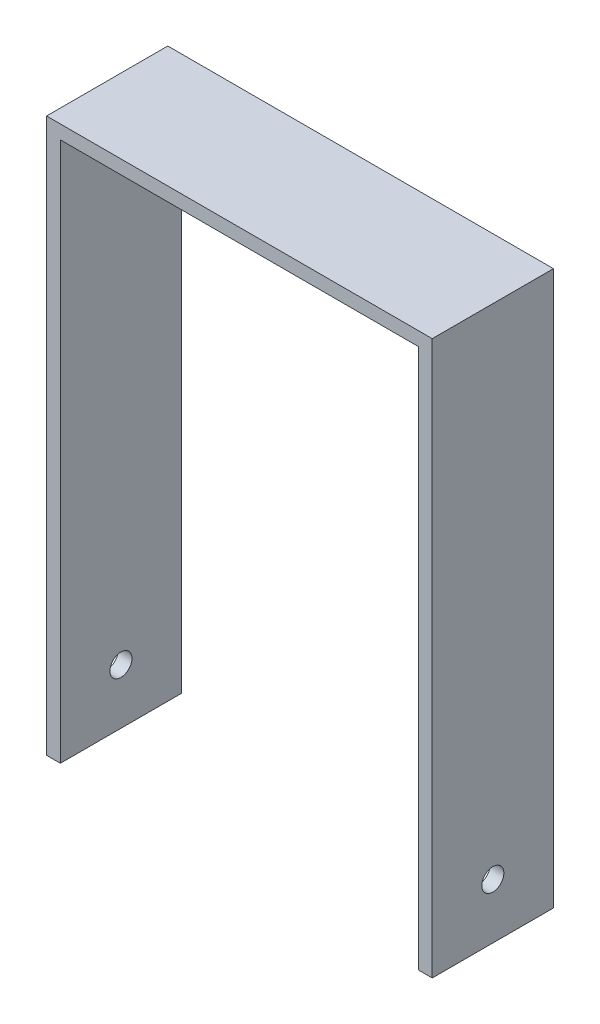
ISO-10303-21;
HEADER;
FILE_DESCRIPTION(('STEP AP214'),'2;1');
FILE_NAME('part.step','',(''),(''),'','','');
FILE_SCHEMA(('AUTOMOTIVE_DESIGN { 1 0 10303 214 1 1 1 1 }'));
ENDSEC;
DATA;
#1=APPLICATION_CONTEXT('core data for automotive mechanical design processes');
#2=APPLICATION_PROTOCOL_DEFINITION('international standard','automotive_design',2000,#1);
#3=PRODUCT_CONTEXT('',#1,'mechanical');
#4=PRODUCT('Part','Part','',(#3));
#5=PRODUCT_RELATED_PRODUCT_CATEGORY('part','',(#4));
#6=PRODUCT_DEFINITION_FORMATION('','',#4);
#7=PRODUCT_DEFINITION_CONTEXT('part definition',#1,'design');
#8=PRODUCT_DEFINITION('design','',#6,#7);
#9=PRODUCT_DEFINITION_SHAPE('','',#8);
#10=(LENGTH_UNIT() NAMED_UNIT(*) SI_UNIT(.MILLI.,.METRE.));
#11=(NAMED_UNIT(*) PLANE_ANGLE_UNIT() SI_UNIT($,.RADIAN.));
#12=(NAMED_UNIT(*) SI_UNIT($,.STERADIAN.) SOLID_ANGLE_UNIT());
#13=UNCERTAINTY_MEASURE_WITH_UNIT(LENGTH_MEASURE(1.E-05),#10,'distance_accuracy_value','');
#14=(GEOMETRIC_REPRESENTATION_CONTEXT(3) GLOBAL_UNCERTAINTY_ASSIGNED_CONTEXT((#13)) GLOBAL_UNIT_ASSIGNED_CONTEXT((#10,
#11,#12)) REPRESENTATION_CONTEXT('',''));
#15=CARTESIAN_POINT('',(0.,0.,0.));
#16=DIRECTION('',(0.,0.,1.));
#17=DIRECTION('',(1.,0.,0.));
#18=AXIS2_PLACEMENT_3D('',#15,#16,#17);
#19=CARTESIAN_POINT('',(32.5,88.,166.544657976415));
#20=DIRECTION('',(0.,-1.,0.));
#21=DIRECTION('',(0.,0.,-1.));
#22=AXIS2_PLACEMENT_3D('',#19,#20,#21);
#23=PLANE('',#22);
#24=DIRECTION('',(0.,0.,-1.));
#25=VECTOR('',#24,1.);
#26=CARTESIAN_POINT('',(-32.5,88.,166.544657976415));
#27=LINE('',#26,#25);
#28=CARTESIAN_POINT('',(-32.5,88.,11.));
#29=VERTEX_POINT('',#28);
#30=CARTESIAN_POINT('',(-32.5,88.,-7.99999999999998));
#31=VERTEX_POINT('',#30);
#32=EDGE_CURVE('E249',#29,#31,#27,.T.);
#33=ORIENTED_EDGE('',*,*,#32,.T.);
#34=DIRECTION('',(1.,0.,0.));
#35=VECTOR('',#34,1.);
#36=CARTESIAN_POINT('',(32.5,88.,-7.99999999999998));
#37=LINE('',#36,#35);
#38=CARTESIAN_POINT('',(32.5,88.,-7.99999999999998));
#39=VERTEX_POINT('',#38);
#40=EDGE_CURVE('E242',#31,#39,#37,.T.);
#41=ORIENTED_EDGE('',*,*,#40,.T.);
#42=DIRECTION('',(0.,0.,-1.));
#43=VECTOR('',#42,1.);
#44=CARTESIAN_POINT('',(32.5,88.,166.544657976415));
#45=LINE('',#44,#43);
#46=CARTESIAN_POINT('',(32.5,88.,11.));
#47=VERTEX_POINT('',#46);
#48=EDGE_CURVE('E175',#47,#39,#45,.T.);
#49=ORIENTED_EDGE('',*,*,#48,.F.);
#50=DIRECTION('',(-1.,0.,0.));
#51=VECTOR('',#50,1.);
#52=CARTESIAN_POINT('',(35.,88.,11.));
#53=LINE('',#52,#51);
#54=EDGE_CURVE('E136',#47,#29,#53,.T.);
#55=ORIENTED_EDGE('',*,*,#54,.T.);
#56=EDGE_LOOP('',(#33,#41,#49,#55));
#57=FACE_BOUND('',#56,.T.);
#58=ADVANCED_FACE('F33',(#57),#23,.T.);
#59=CARTESIAN_POINT('',(35.,-10.,11.));
#60=DIRECTION('',(0.,0.,-1.));
#61=DIRECTION('',(-1.,0.,0.));
#62=AXIS2_PLACEMENT_3D('',#59,#60,#61);
#63=PLANE('',#62);
#64=DIRECTION('',(0.,1.,0.));
#65=VECTOR('',#64,1.);
#66=CARTESIAN_POINT('',(32.5,-10.,11.));
#67=LINE('',#66,#65);
#68=CARTESIAN_POINT('',(32.5,-10.,11.));
#69=VERTEX_POINT('',#68);
#70=EDGE_CURVE('E134',#69,#47,#67,.T.);
#71=ORIENTED_EDGE('',*,*,#70,.F.);
#72=DIRECTION('',(-1.,0.,0.));
#73=VECTOR('',#72,1.);
#74=CARTESIAN_POINT('',(35.,-10.,11.));
#75=LINE('',#74,#73);
#76=CARTESIAN_POINT('',(35.,-10.,11.));
#77=VERTEX_POINT('',#76);
#78=EDGE_CURVE('E11',#77,#69,#75,.T.);
#79=ORIENTED_EDGE('',*,*,#78,.F.);
#80=DIRECTION('',(0.,-1.,0.));
#81=VECTOR('',#80,1.);
#82=CARTESIAN_POINT('',(35.,-10.,11.));
#83=LINE('',#82,#81);
#84=CARTESIAN_POINT('',(35.,90.5,11.));
#85=VERTEX_POINT('',#84);
#86=EDGE_CURVE('E121',#85,#77,#83,.T.);
#87=ORIENTED_EDGE('',*,*,#86,.F.);
#88=DIRECTION('',(-1.,0.,0.));
#89=VECTOR('',#88,1.);
#90=CARTESIAN_POINT('',(35.,90.5,11.));
#91=LINE('',#90,#89);
#92=CARTESIAN_POINT('',(-35.,90.5,11.));
#93=VERTEX_POINT('',#92);
#94=EDGE_CURVE('E153',#85,#93,#91,.T.);
#95=ORIENTED_EDGE('',*,*,#94,.T.);
#96=DIRECTION('',(0.,-1.,0.));
#97=VECTOR('',#96,1.);
#98=CARTESIAN_POINT('',(-35.,-10.,11.));
#99=LINE('',#98,#97);
#100=CARTESIAN_POINT('',(-35.,-10.,11.));
#101=VERTEX_POINT('',#100);
#102=EDGE_CURVE('E148',#93,#101,#99,.T.);
#103=ORIENTED_EDGE('',*,*,#102,.T.);
#104=CARTESIAN_POINT('',(-32.5,-10.,11.));
#105=VERTEX_POINT('',#104);
#106=EDGE_CURVE('E42',#105,#101,#75,.T.);
#107=ORIENTED_EDGE('',*,*,#106,.F.);
#108=DIRECTION('',(0.,-1.,0.));
#109=VECTOR('',#108,1.);
#110=CARTESIAN_POINT('',(-32.5,-10.,11.));
#111=LINE('',#110,#109);
#112=EDGE_CURVE('E173',#29,#105,#111,.T.);
#113=ORIENTED_EDGE('',*,*,#112,.F.);
#114=ORIENTED_EDGE('',*,*,#54,.F.);
#115=EDGE_LOOP('',(#71,#79,#87,#95,#103,#107,#113,#114));
#116=FACE_BOUND('',#115,.T.);
#117=ADVANCED_FACE('F35',(#116),#63,.F.);
#118=CARTESIAN_POINT('',(35.,-10.,11.));
#119=DIRECTION('',(0.,1.,0.));
#120=DIRECTION('',(0.,0.,1.));
#121=AXIS2_PLACEMENT_3D('',#118,#119,#120);
#122=PLANE('',#121);
#123=DIRECTION('',(0.,0.,-1.));
#124=VECTOR('',#123,1.);
#125=CARTESIAN_POINT('',(32.5,-10.,166.544657976415));
#126=LINE('',#125,#124);
#127=CARTESIAN_POINT('',(32.5,-10.,-11.));
#128=VERTEX_POINT('',#127);
#129=EDGE_CURVE('E170',#69,#128,#126,.T.);
#130=ORIENTED_EDGE('',*,*,#129,.T.);
#131=DIRECTION('',(-1.,0.,0.));
#132=VECTOR('',#131,1.);
#133=CARTESIAN_POINT('',(35.,-10.,-11.));
#134=LINE('',#133,#132);
#135=CARTESIAN_POINT('',(35.,-10.,-11.));
#136=VERTEX_POINT('',#135);
#137=EDGE_CURVE('E117',#136,#128,#134,.T.);
#138=ORIENTED_EDGE('',*,*,#137,.F.);
#139=DIRECTION('',(0.,0.,-1.));
#140=VECTOR('',#139,1.);
#141=CARTESIAN_POINT('',(35.,-10.,11.));
#142=LINE('',#141,#140);
#143=EDGE_CURVE('E110',#77,#136,#142,.T.);
#144=ORIENTED_EDGE('',*,*,#143,.F.);
#145=ORIENTED_EDGE('',*,*,#78,.T.);
#146=EDGE_LOOP('',(#130,#138,#144,#145));
#147=FACE_BOUND('',#146,.T.);
#148=ADVANCED_FACE('F113',(#147),#122,.F.);
#149=DIRECTION('',(0.,0.,-1.));
#150=VECTOR('',#149,1.);
#151=CARTESIAN_POINT('',(-32.5,-10.,166.544657976415));
#152=LINE('',#151,#150);
#153=CARTESIAN_POINT('',(-32.5,-10.,-11.));
#154=VERTEX_POINT('',#153);
#155=EDGE_CURVE('E177',#105,#154,#152,.T.);
#156=ORIENTED_EDGE('',*,*,#155,.F.);
#157=ORIENTED_EDGE('',*,*,#106,.T.);
#158=DIRECTION('',(0.,0.,-1.));
#159=VECTOR('',#158,1.);
#160=CARTESIAN_POINT('',(-35.,-10.,11.));
#161=LINE('',#160,#159);
#162=CARTESIAN_POINT('',(-35.,-10.,-11.));
#163=VERTEX_POINT('',#162);
#164=EDGE_CURVE('E156',#101,#163,#161,.T.);
#165=ORIENTED_EDGE('',*,*,#164,.T.);
#166=EDGE_CURVE('E166',#154,#163,#134,.T.);
#167=ORIENTED_EDGE('',*,*,#166,.F.);
#168=EDGE_LOOP('',(#156,#157,#165,#167));
#169=FACE_BOUND('',#168,.T.);
#170=ADVANCED_FACE('F268',(#169),#122,.F.);
#171=CARTESIAN_POINT('',(35.,-10.,-11.));
#172=DIRECTION('',(0.,0.,1.));
#173=DIRECTION('',(0.,-1.,0.));
#174=AXIS2_PLACEMENT_3D('',#171,#172,#173);
#175=PLANE('',#174);
#176=DIRECTION('',(0.,-1.,0.));
#177=VECTOR('',#176,1.);
#178=CARTESIAN_POINT('',(32.5,-10.,-11.));
#179=LINE('',#178,#177);
#180=CARTESIAN_POINT('',(32.5,75.,-11.));
#181=VERTEX_POINT('',#180);
#182=EDGE_CURVE('E138',#181,#128,#179,.T.);
#183=ORIENTED_EDGE('',*,*,#182,.F.);
#184=DIRECTION('',(-1.,0.,0.));
#185=VECTOR('',#184,1.);
#186=CARTESIAN_POINT('',(32.5,75.,-11.));
#187=LINE('',#186,#185);
#188=CARTESIAN_POINT('',(-32.5,75.,-11.));
#189=VERTEX_POINT('',#188);
#190=EDGE_CURVE('E233',#181,#189,#187,.T.);
#191=ORIENTED_EDGE('',*,*,#190,.T.);
#192=DIRECTION('',(0.,1.,0.));
#193=VECTOR('',#192,1.);
#194=CARTESIAN_POINT('',(-32.5,-10.,-11.));
#195=LINE('',#194,#193);
#196=EDGE_CURVE('E169',#154,#189,#195,.T.);
#197=ORIENTED_EDGE('',*,*,#196,.F.);
#198=ORIENTED_EDGE('',*,*,#166,.T.);
#199=DIRECTION('',(0.,1.,0.));
#200=VECTOR('',#199,1.);
#201=CARTESIAN_POINT('',(-35.,-10.,-11.));
#202=LINE('',#201,#200);
#203=CARTESIAN_POINT('',(-35.,90.5,-11.));
#204=VERTEX_POINT('',#203);
#205=EDGE_CURVE('E159',#163,#204,#202,.T.);
#206=ORIENTED_EDGE('',*,*,#205,.T.);
#207=DIRECTION('',(-1.,0.,0.));
#208=VECTOR('',#207,1.);
#209=CARTESIAN_POINT('',(35.,90.5,-11.));
#210=LINE('',#209,#208);
#211=CARTESIAN_POINT('',(35.,90.5,-11.));
#212=VERTEX_POINT('',#211);
#213=EDGE_CURVE('E163',#212,#204,#210,.T.);
#214=ORIENTED_EDGE('',*,*,#213,.F.);
#215=DIRECTION('',(0.,1.,0.));
#216=VECTOR('',#215,1.);
#217=CARTESIAN_POINT('',(35.,-10.,-11.));
#218=LINE('',#217,#216);
#219=EDGE_CURVE('E120',#136,#212,#218,.T.);
#220=ORIENTED_EDGE('',*,*,#219,.F.);
#221=ORIENTED_EDGE('',*,*,#137,.T.);
#222=EDGE_LOOP('',(#183,#191,#197,#198,#206,#214,#220,#221));
#223=FACE_BOUND('',#222,.T.);
#224=CARTESIAN_POINT('',(0.,81.5,-11.));
#225=DIRECTION('',(0.,0.,-1.));
#226=DIRECTION('',(0.,1.,0.));
#227=AXIS2_PLACEMENT_3D('',#224,#225,#226);
#228=CIRCLE('',#227,2.5);
#229=CARTESIAN_POINT('',(0.,84.,-11.));
#230=VERTEX_POINT('',#229);
#231=EDGE_CURVE('E230',#230,#230,#228,.T.);
#232=ORIENTED_EDGE('',*,*,#231,.F.);
#233=EDGE_LOOP('',(#232));
#234=FACE_BOUND('',#233,.T.);
#235=ADVANCED_FACE('F257',(#223,#234),#175,.F.);
#236=CARTESIAN_POINT('',(35.,0.,0.));
#237=DIRECTION('',(-1.,0.,0.));
#238=DIRECTION('',(0.,0.,1.));
#239=AXIS2_PLACEMENT_3D('',#236,#237,#238);
#240=CYLINDRICAL_SURFACE('',#239,2.);
#241=CARTESIAN_POINT('',(35.,0.,0.));
#242=DIRECTION('',(1.,0.,0.));
#243=DIRECTION('',(0.,0.,-1.));
#244=AXIS2_PLACEMENT_3D('',#241,#242,#243);
#245=CIRCLE('',#244,2.);
#246=CARTESIAN_POINT('',(35.,0.,-2.));
#247=VERTEX_POINT('',#246);
#248=EDGE_CURVE('E145',#247,#247,#245,.T.);
#249=ORIENTED_EDGE('',*,*,#248,.T.);
#250=EDGE_LOOP('',(#249));
#251=FACE_BOUND('',#250,.T.);
#252=CARTESIAN_POINT('',(32.5,0.,0.));
#253=DIRECTION('',(-1.,0.,0.));
#254=DIRECTION('',(0.,0.,1.));
#255=AXIS2_PLACEMENT_3D('',#252,#253,#254);
#256=CIRCLE('',#255,2.);
#257=CARTESIAN_POINT('',(32.5,0.,2.));
#258=VERTEX_POINT('',#257);
#259=EDGE_CURVE('E37',#258,#258,#256,.T.);
#260=ORIENTED_EDGE('',*,*,#259,.T.);
#261=EDGE_LOOP('',(#260));
#262=FACE_BOUND('',#261,.T.);
#263=ADVANCED_FACE('F187',(#251,#262),#240,.F.);
#264=CARTESIAN_POINT('',(-35.,0.,0.));
#265=DIRECTION('',(1.,0.,0.));
#266=DIRECTION('',(0.,0.,-1.));
#267=AXIS2_PLACEMENT_3D('',#264,#265,#266);
#268=CIRCLE('',#267,2.);
#269=CARTESIAN_POINT('',(-35.,0.,-2.));
#270=VERTEX_POINT('',#269);
#271=EDGE_CURVE('E140',#270,#270,#268,.T.);
#272=ORIENTED_EDGE('',*,*,#271,.F.);
#273=EDGE_LOOP('',(#272));
#274=FACE_BOUND('',#273,.T.);
#275=CARTESIAN_POINT('',(-32.5,0.,0.));
#276=DIRECTION('',(1.,0.,0.));
#277=DIRECTION('',(0.,0.,-1.));
#278=AXIS2_PLACEMENT_3D('',#275,#276,#277);
#279=CIRCLE('',#278,2.);
#280=CARTESIAN_POINT('',(-32.5,0.,-2.));
#281=VERTEX_POINT('',#280);
#282=EDGE_CURVE('E167',#281,#281,#279,.T.);
#283=ORIENTED_EDGE('',*,*,#282,.T.);
#284=EDGE_LOOP('',(#283));
#285=FACE_BOUND('',#284,.T.);
#286=ADVANCED_FACE('F280',(#274,#285),#240,.F.);
#287=CARTESIAN_POINT('',(35.,0.,0.));
#288=DIRECTION('',(-1.,0.,0.));
#289=DIRECTION('',(0.,0.,1.));
#290=AXIS2_PLACEMENT_3D('',#287,#288,#289);
#291=PLANE('',#290);
#292=ORIENTED_EDGE('',*,*,#86,.T.);
#293=ORIENTED_EDGE('',*,*,#143,.T.);
#294=ORIENTED_EDGE('',*,*,#219,.T.);
#295=DIRECTION('',(0.,0.,1.));
#296=VECTOR('',#295,1.);
#297=CARTESIAN_POINT('',(35.,90.5,11.));
#298=LINE('',#297,#296);
#299=EDGE_CURVE('E127',#212,#85,#298,.T.);
#300=ORIENTED_EDGE('',*,*,#299,.T.);
#301=EDGE_LOOP('',(#292,#293,#294,#300));
#302=FACE_BOUND('',#301,.T.);
#303=ORIENTED_EDGE('',*,*,#248,.F.);
#304=EDGE_LOOP('',(#303));
#305=FACE_BOUND('',#304,.T.);
#306=ADVANCED_FACE('F124',(#302,#305),#291,.F.);
#307=CARTESIAN_POINT('',(-35.,0.,0.));
#308=DIRECTION('',(-1.,0.,0.));
#309=DIRECTION('',(0.,0.,1.));
#310=AXIS2_PLACEMENT_3D('',#307,#308,#309);
#311=PLANE('',#310);
#312=ORIENTED_EDGE('',*,*,#102,.F.);
#313=DIRECTION('',(0.,0.,1.));
#314=VECTOR('',#313,1.);
#315=CARTESIAN_POINT('',(-35.,90.5,11.));
#316=LINE('',#315,#314);
#317=EDGE_CURVE('E131',#204,#93,#316,.T.);
#318=ORIENTED_EDGE('',*,*,#317,.F.);
#319=ORIENTED_EDGE('',*,*,#205,.F.);
#320=ORIENTED_EDGE('',*,*,#164,.F.);
#321=EDGE_LOOP('',(#312,#318,#319,#320));
#322=FACE_BOUND('',#321,.T.);
#323=ORIENTED_EDGE('',*,*,#271,.T.);
#324=EDGE_LOOP('',(#323));
#325=FACE_BOUND('',#324,.T.);
#326=ADVANCED_FACE('F200',(#322,#325),#311,.T.);
#327=CARTESIAN_POINT('',(35.,90.5,11.));
#328=DIRECTION('',(0.,-1.,0.));
#329=DIRECTION('',(0.,0.,-1.));
#330=AXIS2_PLACEMENT_3D('',#327,#328,#329);
#331=PLANE('',#330);
#332=ORIENTED_EDGE('',*,*,#317,.T.);
#333=ORIENTED_EDGE('',*,*,#94,.F.);
#334=ORIENTED_EDGE('',*,*,#299,.F.);
#335=ORIENTED_EDGE('',*,*,#213,.T.);
#336=EDGE_LOOP('',(#332,#333,#334,#335));
#337=FACE_BOUND('',#336,.T.);
#338=ADVANCED_FACE('F192',(#337),#331,.F.);
#339=CARTESIAN_POINT('',(32.5,-10.,166.544657976415));
#340=DIRECTION('',(-1.,0.,0.));
#341=DIRECTION('',(0.,0.,1.));
#342=AXIS2_PLACEMENT_3D('',#339,#340,#341);
#343=PLANE('',#342);
#344=DIRECTION('',(0.,0.,-1.));
#345=VECTOR('',#344,1.);
#346=CARTESIAN_POINT('',(32.5,75.,-7.99999999999998));
#347=LINE('',#346,#345);
#348=CARTESIAN_POINT('',(32.5,75.,-7.99999999999998));
#349=VERTEX_POINT('',#348);
#350=EDGE_CURVE('E54',#349,#181,#347,.T.);
#351=ORIENTED_EDGE('',*,*,#350,.T.);
#352=ORIENTED_EDGE('',*,*,#182,.T.);
#353=ORIENTED_EDGE('',*,*,#129,.F.);
#354=ORIENTED_EDGE('',*,*,#70,.T.);
#355=ORIENTED_EDGE('',*,*,#48,.T.);
#356=DIRECTION('',(0.,-1.,0.));
#357=VECTOR('',#356,1.);
#358=CARTESIAN_POINT('',(32.5,88.,-7.99999999999998));
#359=LINE('',#358,#357);
#360=EDGE_CURVE('E50',#39,#349,#359,.T.);
#361=ORIENTED_EDGE('',*,*,#360,.T.);
#362=EDGE_LOOP('',(#351,#352,#353,#354,#355,#361));
#363=FACE_BOUND('',#362,.T.);
#364=ORIENTED_EDGE('',*,*,#259,.F.);
#365=EDGE_LOOP('',(#364));
#366=FACE_BOUND('',#365,.T.);
#367=ADVANCED_FACE('F189',(#363,#366),#343,.T.);
#368=CARTESIAN_POINT('',(-32.5,88.,166.544657976415));
#369=DIRECTION('',(1.,0.,0.));
#370=DIRECTION('',(0.,0.,-1.));
#371=AXIS2_PLACEMENT_3D('',#368,#369,#370);
#372=PLANE('',#371);
#373=DIRECTION('',(0.,0.,-1.));
#374=VECTOR('',#373,1.);
#375=CARTESIAN_POINT('',(-32.5,75.,-7.99999999999998));
#376=LINE('',#375,#374);
#377=CARTESIAN_POINT('',(-32.5,75.,-7.99999999999998));
#378=VERTEX_POINT('',#377);
#379=EDGE_CURVE('E246',#378,#189,#376,.T.);
#380=ORIENTED_EDGE('',*,*,#379,.F.);
#381=DIRECTION('',(0.,1.,0.));
#382=VECTOR('',#381,1.);
#383=CARTESIAN_POINT('',(-32.5,88.,-7.99999999999998));
#384=LINE('',#383,#382);
#385=EDGE_CURVE('E240',#378,#31,#384,.T.);
#386=ORIENTED_EDGE('',*,*,#385,.T.);
#387=ORIENTED_EDGE('',*,*,#32,.F.);
#388=ORIENTED_EDGE('',*,*,#112,.T.);
#389=ORIENTED_EDGE('',*,*,#155,.T.);
#390=ORIENTED_EDGE('',*,*,#196,.T.);
#391=EDGE_LOOP('',(#380,#386,#387,#388,#389,#390));
#392=FACE_BOUND('',#391,.T.);
#393=ORIENTED_EDGE('',*,*,#282,.F.);
#394=EDGE_LOOP('',(#393));
#395=FACE_BOUND('',#394,.T.);
#396=ADVANCED_FACE('F191',(#392,#395),#372,.T.);
#397=CARTESIAN_POINT('',(32.5,75.,-7.99999999999998));
#398=DIRECTION('',(0.,-1.,0.));
#399=DIRECTION('',(0.,0.,-1.));
#400=AXIS2_PLACEMENT_3D('',#397,#398,#399);
#401=PLANE('',#400);
#402=ORIENTED_EDGE('',*,*,#190,.F.);
#403=ORIENTED_EDGE('',*,*,#350,.F.);
#404=DIRECTION('',(-1.,0.,0.));
#405=VECTOR('',#404,1.);
#406=CARTESIAN_POINT('',(32.5,75.,-7.99999999999998));
#407=LINE('',#406,#405);
#408=EDGE_CURVE('E237',#349,#378,#407,.T.);
#409=ORIENTED_EDGE('',*,*,#408,.T.);
#410=ORIENTED_EDGE('',*,*,#379,.T.);
#411=EDGE_LOOP('',(#402,#403,#409,#410));
#412=FACE_BOUND('',#411,.T.);
#413=ADVANCED_FACE('F198',(#412),#401,.T.);
#414=CARTESIAN_POINT('',(0.,0.,-8.));
#415=DIRECTION('',(0.,0.,-1.));
#416=DIRECTION('',(0.,1.,0.));
#417=AXIS2_PLACEMENT_3D('',#414,#415,#416);
#418=PLANE('',#417);
#419=CARTESIAN_POINT('',(0.,81.5,-7.99999999999998));
#420=DIRECTION('',(0.,0.,-1.));
#421=DIRECTION('',(0.,1.,0.));
#422=AXIS2_PLACEMENT_3D('',#419,#420,#421);
#423=CIRCLE('',#422,2.5);
#424=CARTESIAN_POINT('',(0.,84.,-7.99999999999998));
#425=VERTEX_POINT('',#424);
#426=EDGE_CURVE('E227',#425,#425,#423,.T.);
#427=ORIENTED_EDGE('',*,*,#426,.T.);
#428=EDGE_LOOP('',(#427));
#429=FACE_BOUND('',#428,.T.);
#430=ORIENTED_EDGE('',*,*,#360,.F.);
#431=ORIENTED_EDGE('',*,*,#40,.F.);
#432=ORIENTED_EDGE('',*,*,#385,.F.);
#433=ORIENTED_EDGE('',*,*,#408,.F.);
#434=EDGE_LOOP('',(#430,#431,#432,#433));
#435=FACE_BOUND('',#434,.T.);
#436=ADVANCED_FACE('F214',(#429,#435),#418,.F.);
#437=CARTESIAN_POINT('',(0.,81.5,-7.99999999999998));
#438=DIRECTION('',(0.,0.,-1.));
#439=DIRECTION('',(0.,1.,0.));
#440=AXIS2_PLACEMENT_3D('',#437,#438,#439);
#441=CYLINDRICAL_SURFACE('',#440,2.5);
#442=ORIENTED_EDGE('',*,*,#426,.F.);
#443=EDGE_LOOP('',(#442));
#444=FACE_BOUND('',#443,.T.);
#445=ORIENTED_EDGE('',*,*,#231,.T.);
#446=EDGE_LOOP('',(#445));
#447=FACE_BOUND('',#446,.T.);
#448=ADVANCED_FACE('F218',(#444,#447),#441,.F.);
#449=CLOSED_SHELL('',(#58,#117,#148,#170,#235,#263,#286,#306,#326,#338,#367,#396,#413,#436,#448));
#450=MANIFOLD_SOLID_BREP('B2',#449);
#451=ADVANCED_BREP_SHAPE_REPRESENTATION('',(#18,#450),#14);
#452=SHAPE_DEFINITION_REPRESENTATION(#9,#451);
ENDSEC;
END-ISO-10303-21;
